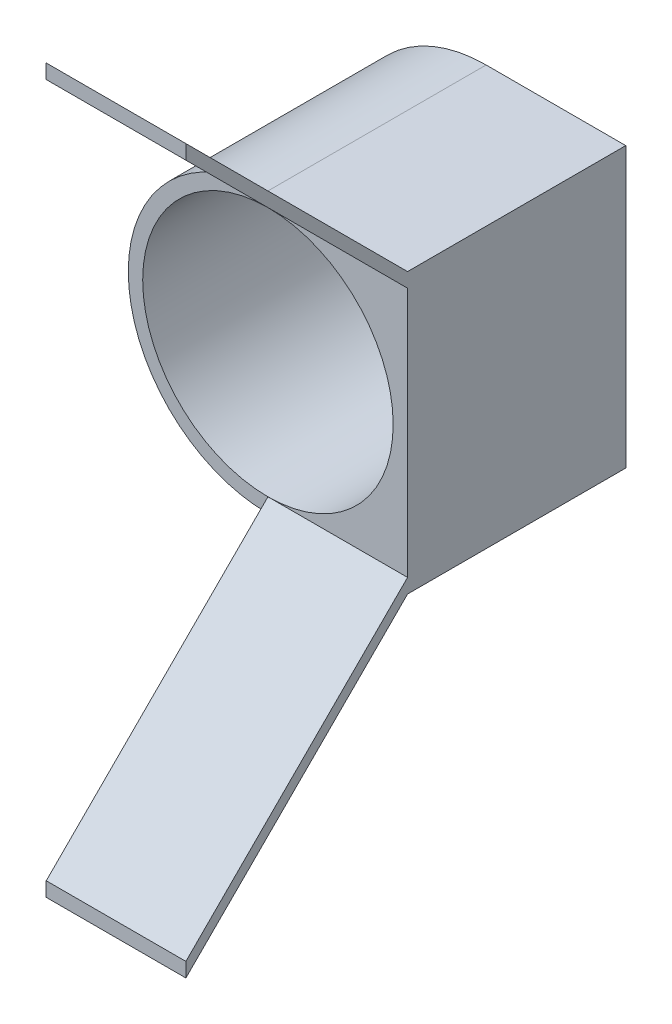
ISO-10303-21;
HEADER;
FILE_DESCRIPTION(('STEP AP214'),'2;1');
FILE_NAME('part.step','',(''),(''),'','','');
FILE_SCHEMA(('AUTOMOTIVE_DESIGN { 1 0 10303 214 1 1 1 1 }'));
ENDSEC;
DATA;
#1=APPLICATION_CONTEXT('core data for automotive mechanical design processes');
#2=APPLICATION_PROTOCOL_DEFINITION('international standard','automotive_design',2000,#1);
#3=PRODUCT_CONTEXT('',#1,'mechanical');
#4=PRODUCT('Part','Part','',(#3));
#5=PRODUCT_RELATED_PRODUCT_CATEGORY('part','',(#4));
#6=PRODUCT_DEFINITION_FORMATION('','',#4);
#7=PRODUCT_DEFINITION_CONTEXT('part definition',#1,'design');
#8=PRODUCT_DEFINITION('design','',#6,#7);
#9=PRODUCT_DEFINITION_SHAPE('','',#8);
#10=(LENGTH_UNIT() NAMED_UNIT(*) SI_UNIT(.MILLI.,.METRE.));
#11=(NAMED_UNIT(*) PLANE_ANGLE_UNIT() SI_UNIT($,.RADIAN.));
#12=(NAMED_UNIT(*) SI_UNIT($,.STERADIAN.) SOLID_ANGLE_UNIT());
#13=UNCERTAINTY_MEASURE_WITH_UNIT(LENGTH_MEASURE(1.E-05),#10,'distance_accuracy_value','');
#14=(GEOMETRIC_REPRESENTATION_CONTEXT(3) GLOBAL_UNCERTAINTY_ASSIGNED_CONTEXT((#13)) GLOBAL_UNIT_ASSIGNED_CONTEXT((#10,
#11,#12)) REPRESENTATION_CONTEXT('',''));
#15=CARTESIAN_POINT('',(0.,0.,0.));
#16=DIRECTION('',(0.,0.,1.));
#17=DIRECTION('',(1.,0.,0.));
#18=AXIS2_PLACEMENT_3D('',#15,#16,#17);
#19=CARTESIAN_POINT('',(0.,0.,25.));
#20=DIRECTION('',(0.,0.,1.));
#21=DIRECTION('',(1.,0.,0.));
#22=AXIS2_PLACEMENT_3D('',#19,#20,#21);
#23=PLANE('',#22);
#24=DIRECTION('',(0.,-1.,0.));
#25=VECTOR('',#24,1.);
#26=CARTESIAN_POINT('',(16.,0.,25.));
#27=LINE('',#26,#25);
#28=CARTESIAN_POINT('',(16.,14.35,25.));
#29=VERTEX_POINT('',#28);
#30=CARTESIAN_POINT('',(16.,-14.35,25.));
#31=VERTEX_POINT('',#30);
#32=EDGE_CURVE('E226',#29,#31,#27,.T.);
#33=ORIENTED_EDGE('',*,*,#32,.F.);
#34=DIRECTION('',(-1.,0.,0.));
#35=VECTOR('',#34,1.);
#36=CARTESIAN_POINT('',(53.106097881615,14.35,25.));
#37=LINE('',#36,#35);
#38=CARTESIAN_POINT('',(0.,14.35,25.));
#39=VERTEX_POINT('',#38);
#40=EDGE_CURVE('E164',#29,#39,#37,.T.);
#41=ORIENTED_EDGE('',*,*,#40,.T.);
#42=CARTESIAN_POINT('',(0.,0.,25.));
#43=DIRECTION('',(0.,0.,1.));
#44=DIRECTION('',(1.,0.,0.));
#45=AXIS2_PLACEMENT_3D('',#42,#43,#44);
#46=CIRCLE('',#45,14.35);
#47=CARTESIAN_POINT('',(0.,-14.35,25.));
#48=VERTEX_POINT('',#47);
#49=EDGE_CURVE('E239',#48,#39,#46,.T.);
#50=ORIENTED_EDGE('',*,*,#49,.F.);
#51=DIRECTION('',(-1.,0.,0.));
#52=VECTOR('',#51,1.);
#53=CARTESIAN_POINT('',(53.106097881615,-14.35,25.));
#54=LINE('',#53,#52);
#55=EDGE_CURVE('E69',#31,#48,#54,.T.);
#56=ORIENTED_EDGE('',*,*,#55,.F.);
#57=EDGE_LOOP('',(#33,#41,#50,#56));
#58=FACE_BOUND('',#57,.T.);
#59=ADVANCED_FACE('F47',(#58),#23,.T.);
#60=EDGE_CURVE('E235',#39,#48,#46,.T.);
#61=ORIENTED_EDGE('',*,*,#60,.F.);
#62=DIRECTION('',(0.,1.,0.));
#63=VECTOR('',#62,1.);
#64=CARTESIAN_POINT('',(0.,0.,25.));
#65=LINE('',#64,#63);
#66=CARTESIAN_POINT('',(0.,16.,25.));
#67=VERTEX_POINT('',#66);
#68=EDGE_CURVE('E162',#39,#67,#65,.T.);
#69=ORIENTED_EDGE('',*,*,#68,.T.);
#70=CARTESIAN_POINT('',(0.,0.,25.));
#71=DIRECTION('',(0.,0.,1.));
#72=DIRECTION('',(1.,0.,0.));
#73=AXIS2_PLACEMENT_3D('',#70,#71,#72);
#74=CIRCLE('',#73,16.);
#75=CARTESIAN_POINT('',(0.,-16.,25.));
#76=VERTEX_POINT('',#75);
#77=EDGE_CURVE('E11',#67,#76,#74,.T.);
#78=ORIENTED_EDGE('',*,*,#77,.T.);
#79=DIRECTION('',(0.,-1.,0.));
#80=VECTOR('',#79,1.);
#81=CARTESIAN_POINT('',(0.,0.,25.));
#82=LINE('',#81,#80);
#83=EDGE_CURVE('E62',#48,#76,#82,.T.);
#84=ORIENTED_EDGE('',*,*,#83,.F.);
#85=EDGE_LOOP('',(#61,#69,#78,#84));
#86=FACE_BOUND('',#85,.T.);
#87=ADVANCED_FACE('F250',(#86),#23,.T.);
#88=CARTESIAN_POINT('',(0.,0.,25.));
#89=DIRECTION('',(0.,0.,-1.));
#90=DIRECTION('',(-1.,0.,0.));
#91=AXIS2_PLACEMENT_3D('',#88,#89,#90);
#92=CYLINDRICAL_SURFACE('',#91,16.);
#93=DIRECTION('',(0.,0.,-1.));
#94=VECTOR('',#93,1.);
#95=CARTESIAN_POINT('',(0.,-16.,47.6274169979695));
#96=LINE('',#95,#94);
#97=CARTESIAN_POINT('',(0.,-16.,0.));
#98=VERTEX_POINT('',#97);
#99=EDGE_CURVE('E207',#76,#98,#96,.T.);
#100=ORIENTED_EDGE('',*,*,#99,.F.);
#101=ORIENTED_EDGE('',*,*,#77,.F.);
#102=DIRECTION('',(0.,0.,-1.));
#103=VECTOR('',#102,1.);
#104=CARTESIAN_POINT('',(0.,16.,47.6274169979695));
#105=LINE('',#104,#103);
#106=CARTESIAN_POINT('',(0.,16.,0.));
#107=VERTEX_POINT('',#106);
#108=EDGE_CURVE('E229',#67,#107,#105,.T.);
#109=ORIENTED_EDGE('',*,*,#108,.T.);
#110=CARTESIAN_POINT('',(0.,0.,0.));
#111=DIRECTION('',(0.,0.,1.));
#112=DIRECTION('',(1.,0.,0.));
#113=AXIS2_PLACEMENT_3D('',#110,#111,#112);
#114=CIRCLE('',#113,16.);
#115=EDGE_CURVE('E51',#107,#98,#114,.T.);
#116=ORIENTED_EDGE('',*,*,#115,.T.);
#117=EDGE_LOOP('',(#100,#101,#109,#116));
#118=FACE_BOUND('',#117,.T.);
#119=ADVANCED_FACE('F49',(#118),#92,.T.);
#120=CARTESIAN_POINT('',(0.,0.,0.));
#121=DIRECTION('',(0.,0.,1.));
#122=DIRECTION('',(1.,0.,0.));
#123=AXIS2_PLACEMENT_3D('',#120,#121,#122);
#124=PLANE('',#123);
#125=ORIENTED_EDGE('',*,*,#115,.F.);
#126=DIRECTION('',(1.,0.,0.));
#127=VECTOR('',#126,1.);
#128=CARTESIAN_POINT('',(0.,16.,0.));
#129=LINE('',#128,#127);
#130=CARTESIAN_POINT('',(16.,16.,0.));
#131=VERTEX_POINT('',#130);
#132=EDGE_CURVE('E210',#107,#131,#129,.T.);
#133=ORIENTED_EDGE('',*,*,#132,.T.);
#134=DIRECTION('',(0.,-1.,0.));
#135=VECTOR('',#134,1.);
#136=CARTESIAN_POINT('',(16.,0.,0.));
#137=LINE('',#136,#135);
#138=CARTESIAN_POINT('',(16.,-16.,0.));
#139=VERTEX_POINT('',#138);
#140=EDGE_CURVE('E220',#131,#139,#137,.T.);
#141=ORIENTED_EDGE('',*,*,#140,.T.);
#142=DIRECTION('',(-1.,0.,0.));
#143=VECTOR('',#142,1.);
#144=CARTESIAN_POINT('',(0.,-16.,0.));
#145=LINE('',#144,#143);
#146=EDGE_CURVE('E170',#139,#98,#145,.T.);
#147=ORIENTED_EDGE('',*,*,#146,.T.);
#148=EDGE_LOOP('',(#125,#133,#141,#147));
#149=FACE_BOUND('',#148,.T.);
#150=CARTESIAN_POINT('',(0.,0.,0.));
#151=DIRECTION('',(0.,0.,1.));
#152=DIRECTION('',(1.,0.,0.));
#153=AXIS2_PLACEMENT_3D('',#150,#151,#152);
#154=CIRCLE('',#153,14.35);
#155=CARTESIAN_POINT('',(14.35,0.,0.));
#156=VERTEX_POINT('',#155);
#157=EDGE_CURVE('E234',#156,#156,#154,.T.);
#158=ORIENTED_EDGE('',*,*,#157,.T.);
#159=EDGE_LOOP('',(#158));
#160=FACE_BOUND('',#159,.T.);
#161=ADVANCED_FACE('F265',(#149,#160),#124,.F.);
#162=CARTESIAN_POINT('',(0.,0.,25.));
#163=DIRECTION('',(0.,0.,-1.));
#164=DIRECTION('',(-1.,0.,0.));
#165=AXIS2_PLACEMENT_3D('',#162,#163,#164);
#166=CYLINDRICAL_SURFACE('',#165,14.35);
#167=ORIENTED_EDGE('',*,*,#60,.T.);
#168=ORIENTED_EDGE('',*,*,#49,.T.);
#169=EDGE_LOOP('',(#167,#168));
#170=FACE_BOUND('',#169,.T.);
#171=ORIENTED_EDGE('',*,*,#157,.F.);
#172=EDGE_LOOP('',(#171));
#173=FACE_BOUND('',#172,.T.);
#174=ADVANCED_FACE('F247',(#170,#173),#166,.F.);
#175=CARTESIAN_POINT('',(0.,16.,47.6274169979695));
#176=DIRECTION('',(0.,1.,0.));
#177=DIRECTION('',(0.,0.,1.));
#178=AXIS2_PLACEMENT_3D('',#175,#176,#177);
#179=PLANE('',#178);
#180=ORIENTED_EDGE('',*,*,#108,.F.);
#181=DIRECTION('',(1.,0.,0.));
#182=VECTOR('',#181,1.);
#183=CARTESIAN_POINT('',(0.,16.,25.));
#184=LINE('',#183,#182);
#185=CARTESIAN_POINT('',(16.,16.,25.));
#186=VERTEX_POINT('',#185);
#187=EDGE_CURVE('E223',#67,#186,#184,.T.);
#188=ORIENTED_EDGE('',*,*,#187,.T.);
#189=DIRECTION('',(0.,0.,-1.));
#190=VECTOR('',#189,1.);
#191=CARTESIAN_POINT('',(16.,16.,47.6274169979695));
#192=LINE('',#191,#190);
#193=EDGE_CURVE('E132',#186,#131,#192,.T.);
#194=ORIENTED_EDGE('',*,*,#193,.T.);
#195=ORIENTED_EDGE('',*,*,#132,.F.);
#196=EDGE_LOOP('',(#180,#188,#194,#195));
#197=FACE_BOUND('',#196,.T.);
#198=ADVANCED_FACE('F263',(#197),#179,.T.);
#199=CARTESIAN_POINT('',(16.,0.,47.6274169979695));
#200=DIRECTION('',(1.,0.,0.));
#201=DIRECTION('',(0.,0.,-1.));
#202=AXIS2_PLACEMENT_3D('',#199,#200,#201);
#203=PLANE('',#202);
#204=ORIENTED_EDGE('',*,*,#193,.F.);
#205=DIRECTION('',(0.,0.707106781186546,0.707106781186549));
#206=VECTOR('',#205,1.);
#207=CARTESIAN_POINT('',(16.,-4.49999999999998,4.49999999999996));
#208=LINE('',#207,#206);
#209=CARTESIAN_POINT('',(16.,41.3999999999999,50.4));
#210=VERTEX_POINT('',#209);
#211=EDGE_CURVE('E125',#186,#210,#208,.T.);
#212=ORIENTED_EDGE('',*,*,#211,.T.);
#213=DIRECTION('',(0.,1.,0.));
#214=VECTOR('',#213,1.);
#215=CARTESIAN_POINT('',(16.,0.,50.4));
#216=LINE('',#215,#214);
#217=CARTESIAN_POINT('',(16.,39.7499999999999,50.4));
#218=VERTEX_POINT('',#217);
#219=EDGE_CURVE('E129',#218,#210,#216,.T.);
#220=ORIENTED_EDGE('',*,*,#219,.F.);
#221=DIRECTION('',(0.,0.707106781186546,0.707106781186549));
#222=VECTOR('',#221,1.);
#223=CARTESIAN_POINT('',(16.,-5.32499999999998,5.32499999999996));
#224=LINE('',#223,#222);
#225=EDGE_CURVE('E160',#29,#218,#224,.T.);
#226=ORIENTED_EDGE('',*,*,#225,.F.);
#227=ORIENTED_EDGE('',*,*,#32,.T.);
#228=DIRECTION('',(0.,-0.707106781186546,0.707106781186549));
#229=VECTOR('',#228,1.);
#230=CARTESIAN_POINT('',(16.,5.32499999999998,5.32499999999996));
#231=LINE('',#230,#229);
#232=CARTESIAN_POINT('',(16.,-39.7499999999999,50.4));
#233=VERTEX_POINT('',#232);
#234=EDGE_CURVE('E191',#31,#233,#231,.T.);
#235=ORIENTED_EDGE('',*,*,#234,.T.);
#236=DIRECTION('',(0.,-1.,0.));
#237=VECTOR('',#236,1.);
#238=CARTESIAN_POINT('',(16.,0.,50.4));
#239=LINE('',#238,#237);
#240=CARTESIAN_POINT('',(16.,-41.3999999999999,50.4));
#241=VERTEX_POINT('',#240);
#242=EDGE_CURVE('E186',#233,#241,#239,.T.);
#243=ORIENTED_EDGE('',*,*,#242,.T.);
#244=DIRECTION('',(0.,-0.707106781186546,0.707106781186549));
#245=VECTOR('',#244,1.);
#246=CARTESIAN_POINT('',(16.,4.49999999999996,4.49999999999995));
#247=LINE('',#246,#245);
#248=CARTESIAN_POINT('',(16.,-16.,25.));
#249=VERTEX_POINT('',#248);
#250=EDGE_CURVE('E175',#249,#241,#247,.T.);
#251=ORIENTED_EDGE('',*,*,#250,.F.);
#252=DIRECTION('',(0.,0.,-1.));
#253=VECTOR('',#252,1.);
#254=CARTESIAN_POINT('',(16.,-16.,47.6274169979695));
#255=LINE('',#254,#253);
#256=EDGE_CURVE('E202',#249,#139,#255,.T.);
#257=ORIENTED_EDGE('',*,*,#256,.T.);
#258=ORIENTED_EDGE('',*,*,#140,.F.);
#259=EDGE_LOOP('',(#204,#212,#220,#226,#227,#235,#243,#251,#257,#258));
#260=FACE_BOUND('',#259,.T.);
#261=ADVANCED_FACE('F127',(#260),#203,.T.);
#262=CARTESIAN_POINT('',(0.,-16.,47.6274169979695));
#263=DIRECTION('',(0.,-1.,0.));
#264=DIRECTION('',(0.,0.,-1.));
#265=AXIS2_PLACEMENT_3D('',#262,#263,#264);
#266=PLANE('',#265);
#267=ORIENTED_EDGE('',*,*,#256,.F.);
#268=DIRECTION('',(-1.,0.,0.));
#269=VECTOR('',#268,1.);
#270=CARTESIAN_POINT('',(0.,-16.,25.));
#271=LINE('',#270,#269);
#272=EDGE_CURVE('E206',#249,#76,#271,.T.);
#273=ORIENTED_EDGE('',*,*,#272,.T.);
#274=ORIENTED_EDGE('',*,*,#99,.T.);
#275=ORIENTED_EDGE('',*,*,#146,.F.);
#276=EDGE_LOOP('',(#267,#273,#274,#275));
#277=FACE_BOUND('',#276,.T.);
#278=ADVANCED_FACE('F269',(#277),#266,.T.);
#279=CARTESIAN_POINT('',(0.,0.,0.));
#280=DIRECTION('',(1.,0.,0.));
#281=DIRECTION('',(0.,0.,-1.));
#282=AXIS2_PLACEMENT_3D('',#279,#280,#281);
#283=PLANE('',#282);
#284=ORIENTED_EDGE('',*,*,#83,.T.);
#285=DIRECTION('',(0.,-0.707106781186546,0.707106781186549));
#286=VECTOR('',#285,1.);
#287=CARTESIAN_POINT('',(0.,4.49999999999996,4.49999999999995));
#288=LINE('',#287,#286);
#289=CARTESIAN_POINT('',(0.,-41.3999999999999,50.4));
#290=VERTEX_POINT('',#289);
#291=EDGE_CURVE('E171',#76,#290,#288,.T.);
#292=ORIENTED_EDGE('',*,*,#291,.T.);
#293=DIRECTION('',(0.,-1.,0.));
#294=VECTOR('',#293,1.);
#295=CARTESIAN_POINT('',(0.,0.,50.4));
#296=LINE('',#295,#294);
#297=CARTESIAN_POINT('',(0.,-39.7499999999999,50.4));
#298=VERTEX_POINT('',#297);
#299=EDGE_CURVE('E176',#298,#290,#296,.T.);
#300=ORIENTED_EDGE('',*,*,#299,.F.);
#301=DIRECTION('',(0.,-0.707106781186546,0.707106781186549));
#302=VECTOR('',#301,1.);
#303=CARTESIAN_POINT('',(0.,5.32499999999998,5.32499999999996));
#304=LINE('',#303,#302);
#305=EDGE_CURVE('E138',#48,#298,#304,.T.);
#306=ORIENTED_EDGE('',*,*,#305,.F.);
#307=EDGE_LOOP('',(#284,#292,#300,#306));
#308=FACE_BOUND('',#307,.T.);
#309=ADVANCED_FACE('F276',(#308),#283,.F.);
#310=CARTESIAN_POINT('',(53.106097881615,4.49999999999996,4.49999999999995));
#311=DIRECTION('',(0.,-0.707106781186549,-0.707106781186546));
#312=DIRECTION('',(0.,0.707106781186546,-0.707106781186549));
#313=AXIS2_PLACEMENT_3D('',#310,#311,#312);
#314=PLANE('',#313);
#315=ORIENTED_EDGE('',*,*,#272,.F.);
#316=ORIENTED_EDGE('',*,*,#250,.T.);
#317=DIRECTION('',(-1.,0.,0.));
#318=VECTOR('',#317,1.);
#319=CARTESIAN_POINT('',(53.106097881615,-41.3999999999999,50.4));
#320=LINE('',#319,#318);
#321=EDGE_CURVE('E190',#241,#290,#320,.T.);
#322=ORIENTED_EDGE('',*,*,#321,.T.);
#323=ORIENTED_EDGE('',*,*,#291,.F.);
#324=EDGE_LOOP('',(#315,#316,#322,#323));
#325=FACE_BOUND('',#324,.T.);
#326=ADVANCED_FACE('F278',(#325),#314,.T.);
#327=CARTESIAN_POINT('',(53.106097881615,0.,50.4));
#328=DIRECTION('',(0.,0.,-1.));
#329=DIRECTION('',(-1.,0.,0.));
#330=AXIS2_PLACEMENT_3D('',#327,#328,#329);
#331=PLANE('',#330);
#332=ORIENTED_EDGE('',*,*,#242,.F.);
#333=DIRECTION('',(-1.,0.,0.));
#334=VECTOR('',#333,1.);
#335=CARTESIAN_POINT('',(53.106097881615,-39.7499999999999,50.4));
#336=LINE('',#335,#334);
#337=EDGE_CURVE('E180',#233,#298,#336,.T.);
#338=ORIENTED_EDGE('',*,*,#337,.T.);
#339=ORIENTED_EDGE('',*,*,#299,.T.);
#340=ORIENTED_EDGE('',*,*,#321,.F.);
#341=EDGE_LOOP('',(#332,#338,#339,#340));
#342=FACE_BOUND('',#341,.T.);
#343=ADVANCED_FACE('F282',(#342),#331,.F.);
#344=CARTESIAN_POINT('',(53.106097881615,5.32499999999998,5.32499999999996));
#345=DIRECTION('',(0.,-0.707106781186549,-0.707106781186546));
#346=DIRECTION('',(0.,0.707106781186546,-0.707106781186549));
#347=AXIS2_PLACEMENT_3D('',#344,#345,#346);
#348=PLANE('',#347);
#349=ORIENTED_EDGE('',*,*,#234,.F.);
#350=ORIENTED_EDGE('',*,*,#55,.T.);
#351=ORIENTED_EDGE('',*,*,#305,.T.);
#352=ORIENTED_EDGE('',*,*,#337,.F.);
#353=EDGE_LOOP('',(#349,#350,#351,#352));
#354=FACE_BOUND('',#353,.T.);
#355=ADVANCED_FACE('F286',(#354),#348,.F.);
#356=CARTESIAN_POINT('',(0.,0.,0.));
#357=DIRECTION('',(1.,0.,0.));
#358=DIRECTION('',(0.,0.,-1.));
#359=AXIS2_PLACEMENT_3D('',#356,#357,#358);
#360=PLANE('',#359);
#361=DIRECTION('',(0.,0.707106781186546,0.707106781186549));
#362=VECTOR('',#361,1.);
#363=CARTESIAN_POINT('',(0.,-5.32499999999998,5.32499999999996));
#364=LINE('',#363,#362);
#365=CARTESIAN_POINT('',(0.,39.7499999999999,50.4));
#366=VERTEX_POINT('',#365);
#367=EDGE_CURVE('E137',#39,#366,#364,.T.);
#368=ORIENTED_EDGE('',*,*,#367,.T.);
#369=DIRECTION('',(0.,1.,0.));
#370=VECTOR('',#369,1.);
#371=CARTESIAN_POINT('',(0.,0.,50.4));
#372=LINE('',#371,#370);
#373=CARTESIAN_POINT('',(0.,41.3999999999999,50.4));
#374=VERTEX_POINT('',#373);
#375=EDGE_CURVE('E153',#366,#374,#372,.T.);
#376=ORIENTED_EDGE('',*,*,#375,.T.);
#377=DIRECTION('',(0.,0.707106781186546,0.707106781186549));
#378=VECTOR('',#377,1.);
#379=CARTESIAN_POINT('',(0.,-4.49999999999998,4.49999999999996));
#380=LINE('',#379,#378);
#381=EDGE_CURVE('E143',#67,#374,#380,.T.);
#382=ORIENTED_EDGE('',*,*,#381,.F.);
#383=ORIENTED_EDGE('',*,*,#68,.F.);
#384=EDGE_LOOP('',(#368,#376,#382,#383));
#385=FACE_BOUND('',#384,.T.);
#386=ADVANCED_FACE('F291',(#385),#360,.F.);
#387=CARTESIAN_POINT('',(53.106097881615,0.,50.4));
#388=DIRECTION('',(0.,0.,1.));
#389=DIRECTION('',(1.,0.,0.));
#390=AXIS2_PLACEMENT_3D('',#387,#388,#389);
#391=PLANE('',#390);
#392=DIRECTION('',(-1.,0.,0.));
#393=VECTOR('',#392,1.);
#394=CARTESIAN_POINT('',(53.106097881615,39.7499999999999,50.4));
#395=LINE('',#394,#393);
#396=EDGE_CURVE('E151',#218,#366,#395,.T.);
#397=ORIENTED_EDGE('',*,*,#396,.F.);
#398=ORIENTED_EDGE('',*,*,#219,.T.);
#399=DIRECTION('',(-1.,0.,0.));
#400=VECTOR('',#399,1.);
#401=CARTESIAN_POINT('',(53.106097881615,41.3999999999999,50.4));
#402=LINE('',#401,#400);
#403=EDGE_CURVE('E141',#210,#374,#402,.T.);
#404=ORIENTED_EDGE('',*,*,#403,.T.);
#405=ORIENTED_EDGE('',*,*,#375,.F.);
#406=EDGE_LOOP('',(#397,#398,#404,#405));
#407=FACE_BOUND('',#406,.T.);
#408=ADVANCED_FACE('F150',(#407),#391,.T.);
#409=CARTESIAN_POINT('',(53.106097881615,-4.49999999999998,4.49999999999996));
#410=DIRECTION('',(0.,-0.707106781186549,0.707106781186546));
#411=DIRECTION('',(0.,-0.707106781186546,-0.707106781186549));
#412=AXIS2_PLACEMENT_3D('',#409,#410,#411);
#413=PLANE('',#412);
#414=ORIENTED_EDGE('',*,*,#211,.F.);
#415=ORIENTED_EDGE('',*,*,#187,.F.);
#416=ORIENTED_EDGE('',*,*,#381,.T.);
#417=ORIENTED_EDGE('',*,*,#403,.F.);
#418=EDGE_LOOP('',(#414,#415,#416,#417));
#419=FACE_BOUND('',#418,.T.);
#420=ADVANCED_FACE('F142',(#419),#413,.F.);
#421=CARTESIAN_POINT('',(53.106097881615,-5.32499999999998,5.32499999999996));
#422=DIRECTION('',(0.,-0.707106781186549,0.707106781186546));
#423=DIRECTION('',(0.,-0.707106781186546,-0.707106781186549));
#424=AXIS2_PLACEMENT_3D('',#421,#422,#423);
#425=PLANE('',#424);
#426=ORIENTED_EDGE('',*,*,#40,.F.);
#427=ORIENTED_EDGE('',*,*,#225,.T.);
#428=ORIENTED_EDGE('',*,*,#396,.T.);
#429=ORIENTED_EDGE('',*,*,#367,.F.);
#430=EDGE_LOOP('',(#426,#427,#428,#429));
#431=FACE_BOUND('',#430,.T.);
#432=ADVANCED_FACE('F289',(#431),#425,.T.);
#433=CLOSED_SHELL('',(#59,#87,#119,#161,#174,#198,#261,#278,#309,#326,#343,#355,#386,#408,#420,#432));
#434=MANIFOLD_SOLID_BREP('B2',#433);
#435=ADVANCED_BREP_SHAPE_REPRESENTATION('',(#18,#434),#14);
#436=SHAPE_DEFINITION_REPRESENTATION(#9,#435);
ENDSEC;
END-ISO-10303-21;
